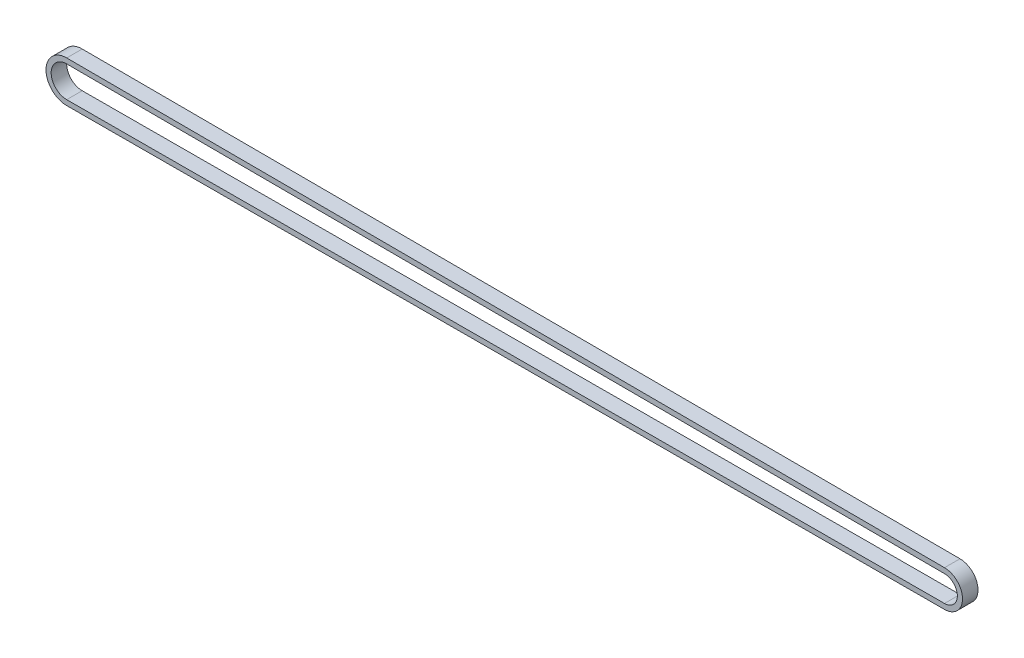
ISO-10303-21;
HEADER;
FILE_DESCRIPTION(('STEP AP214'),'2;1');
FILE_NAME('part.step','',(''),(''),'','','');
FILE_SCHEMA(('AUTOMOTIVE_DESIGN { 1 0 10303 214 1 1 1 1 }'));
ENDSEC;
DATA;
#1=APPLICATION_CONTEXT('core data for automotive mechanical design processes');
#2=APPLICATION_PROTOCOL_DEFINITION('international standard','automotive_design',2000,#1);
#3=PRODUCT_CONTEXT('',#1,'mechanical');
#4=PRODUCT('Part','Part','',(#3));
#5=PRODUCT_RELATED_PRODUCT_CATEGORY('part','',(#4));
#6=PRODUCT_DEFINITION_FORMATION('','',#4);
#7=PRODUCT_DEFINITION_CONTEXT('part definition',#1,'design');
#8=PRODUCT_DEFINITION('design','',#6,#7);
#9=PRODUCT_DEFINITION_SHAPE('','',#8);
#10=(LENGTH_UNIT() NAMED_UNIT(*) SI_UNIT(.MILLI.,.METRE.));
#11=(NAMED_UNIT(*) PLANE_ANGLE_UNIT() SI_UNIT($,.RADIAN.));
#12=(NAMED_UNIT(*) SI_UNIT($,.STERADIAN.) SOLID_ANGLE_UNIT());
#13=UNCERTAINTY_MEASURE_WITH_UNIT(LENGTH_MEASURE(1.E-05),#10,'distance_accuracy_value','');
#14=(GEOMETRIC_REPRESENTATION_CONTEXT(3) GLOBAL_UNCERTAINTY_ASSIGNED_CONTEXT((#13)) GLOBAL_UNIT_ASSIGNED_CONTEXT((#10,
#11,#12)) REPRESENTATION_CONTEXT('',''));
#15=CARTESIAN_POINT('',(0.,0.,0.));
#16=DIRECTION('',(0.,0.,1.));
#17=DIRECTION('',(1.,0.,0.));
#18=AXIS2_PLACEMENT_3D('',#15,#16,#17);
#19=CARTESIAN_POINT('',(-340.,0.,6.));
#20=DIRECTION('',(0.,0.,1.));
#21=DIRECTION('',(1.,0.,0.));
#22=AXIS2_PLACEMENT_3D('',#19,#20,#21);
#23=PLANE('',#22);
#24=CARTESIAN_POINT('',(-340.,0.,6.));
#25=DIRECTION('',(0.,0.,1.));
#26=DIRECTION('',(1.,0.,0.));
#27=AXIS2_PLACEMENT_3D('',#24,#25,#26);
#28=CIRCLE('',#27,8.);
#29=CARTESIAN_POINT('',(-339.976470588235,7.999965397849,6.));
#30=VERTEX_POINT('',#29);
#31=CARTESIAN_POINT('',(-339.976470588235,-7.99996539784908,6.));
#32=VERTEX_POINT('',#31);
#33=EDGE_CURVE('E134',#30,#32,#28,.T.);
#34=ORIENTED_EDGE('',*,*,#33,.T.);
#35=DIRECTION('',(0.99999567473113,0.00294117647058835,0.));
#36=VECTOR('',#35,1.);
#37=CARTESIAN_POINT('',(-339.976470588235,-7.99996539784908,6.));
#38=LINE('',#37,#36);
#39=CARTESIAN_POINT('',(0.0205882352941163,-6.99996972311791,6.));
#40=VERTEX_POINT('',#39);
#41=EDGE_CURVE('E137',#32,#40,#38,.T.);
#42=ORIENTED_EDGE('',*,*,#41,.T.);
#43=CARTESIAN_POINT('',(0.,0.,6.));
#44=DIRECTION('',(0.,0.,1.));
#45=DIRECTION('',(-1.,0.,0.));
#46=AXIS2_PLACEMENT_3D('',#43,#44,#45);
#47=CIRCLE('',#46,7.);
#48=CARTESIAN_POINT('',(0.0205882352940929,6.99996972311791,6.));
#49=VERTEX_POINT('',#48);
#50=EDGE_CURVE('E140',#40,#49,#47,.T.);
#51=ORIENTED_EDGE('',*,*,#50,.T.);
#52=DIRECTION('',(-0.99999567473113,0.00294117647058811,0.));
#53=VECTOR('',#52,1.);
#54=CARTESIAN_POINT('',(-339.976470588235,7.999965397849,6.));
#55=LINE('',#54,#53);
#56=EDGE_CURVE('E142',#49,#30,#55,.T.);
#57=ORIENTED_EDGE('',*,*,#56,.T.);
#58=EDGE_LOOP('',(#34,#42,#51,#57));
#59=FACE_BOUND('',#58,.T.);
#60=DIRECTION('',(0.99999567473113,0.00294117647058835,0.));
#61=VECTOR('',#60,1.);
#62=CARTESIAN_POINT('',(-339.982352941176,-5.99997404838682,6.));
#63=LINE('',#62,#61);
#64=CARTESIAN_POINT('',(-339.982352941176,-5.99997404838682,6.));
#65=VERTEX_POINT('',#64);
#66=CARTESIAN_POINT('',(0.0147058823529402,-4.99997837365565,6.));
#67=VERTEX_POINT('',#66);
#68=EDGE_CURVE('E106',#65,#67,#63,.T.);
#69=ORIENTED_EDGE('',*,*,#68,.F.);
#70=CARTESIAN_POINT('',(-340.,0.,6.));
#71=DIRECTION('',(0.,0.,1.));
#72=DIRECTION('',(1.,0.,0.));
#73=AXIS2_PLACEMENT_3D('',#70,#71,#72);
#74=CIRCLE('',#73,6.);
#75=CARTESIAN_POINT('',(-339.982352941176,5.99997404838674,6.));
#76=VERTEX_POINT('',#75);
#77=EDGE_CURVE('E98',#76,#65,#74,.T.);
#78=ORIENTED_EDGE('',*,*,#77,.F.);
#79=DIRECTION('',(-0.99999567473113,0.00294117647058811,0.));
#80=VECTOR('',#79,1.);
#81=CARTESIAN_POINT('',(-339.982352941176,5.99997404838674,6.));
#82=LINE('',#81,#80);
#83=CARTESIAN_POINT('',(0.0147058823529722,4.99997837365565,6.));
#84=VERTEX_POINT('',#83);
#85=EDGE_CURVE('E120',#84,#76,#82,.T.);
#86=ORIENTED_EDGE('',*,*,#85,.F.);
#87=CARTESIAN_POINT('',(0.,0.,6.));
#88=DIRECTION('',(0.,0.,1.));
#89=DIRECTION('',(-1.,0.,0.));
#90=AXIS2_PLACEMENT_3D('',#87,#88,#89);
#91=CIRCLE('',#90,5.);
#92=EDGE_CURVE('E118',#67,#84,#91,.T.);
#93=ORIENTED_EDGE('',*,*,#92,.F.);
#94=EDGE_LOOP('',(#69,#78,#86,#93));
#95=FACE_BOUND('',#94,.T.);
#96=ADVANCED_FACE('F33',(#59,#95),#23,.T.);
#97=CARTESIAN_POINT('',(-340.,0.,0.));
#98=DIRECTION('',(0.,0.,1.));
#99=DIRECTION('',(1.,0.,0.));
#100=AXIS2_PLACEMENT_3D('',#97,#98,#99);
#101=PLANE('',#100);
#102=CARTESIAN_POINT('',(-340.,0.,0.));
#103=DIRECTION('',(0.,0.,1.));
#104=DIRECTION('',(1.,0.,0.));
#105=AXIS2_PLACEMENT_3D('',#102,#103,#104);
#106=CIRCLE('',#105,8.);
#107=CARTESIAN_POINT('',(-339.976470588235,7.999965397849,0.));
#108=VERTEX_POINT('',#107);
#109=CARTESIAN_POINT('',(-339.976470588235,-7.99996539784908,0.));
#110=VERTEX_POINT('',#109);
#111=EDGE_CURVE('E114',#108,#110,#106,.T.);
#112=ORIENTED_EDGE('',*,*,#111,.F.);
#113=DIRECTION('',(-0.99999567473113,0.00294117647058811,0.));
#114=VECTOR('',#113,1.);
#115=CARTESIAN_POINT('',(-339.976470588235,7.999965397849,0.));
#116=LINE('',#115,#114);
#117=CARTESIAN_POINT('',(0.0205882352940929,6.99996972311791,0.));
#118=VERTEX_POINT('',#117);
#119=EDGE_CURVE('E138',#118,#108,#116,.T.);
#120=ORIENTED_EDGE('',*,*,#119,.F.);
#121=CARTESIAN_POINT('',(0.,0.,0.));
#122=DIRECTION('',(0.,0.,1.));
#123=DIRECTION('',(-1.,0.,0.));
#124=AXIS2_PLACEMENT_3D('',#121,#122,#123);
#125=CIRCLE('',#124,7.);
#126=CARTESIAN_POINT('',(0.0205882352941163,-6.99996972311791,0.));
#127=VERTEX_POINT('',#126);
#128=EDGE_CURVE('E149',#127,#118,#125,.T.);
#129=ORIENTED_EDGE('',*,*,#128,.F.);
#130=DIRECTION('',(0.99999567473113,0.00294117647058835,0.));
#131=VECTOR('',#130,1.);
#132=CARTESIAN_POINT('',(-339.976470588235,-7.99996539784908,0.));
#133=LINE('',#132,#131);
#134=EDGE_CURVE('E147',#110,#127,#133,.T.);
#135=ORIENTED_EDGE('',*,*,#134,.F.);
#136=EDGE_LOOP('',(#112,#120,#129,#135));
#137=FACE_BOUND('',#136,.T.);
#138=CARTESIAN_POINT('',(-340.,0.,0.));
#139=DIRECTION('',(0.,0.,1.));
#140=DIRECTION('',(1.,0.,0.));
#141=AXIS2_PLACEMENT_3D('',#138,#139,#140);
#142=CIRCLE('',#141,6.);
#143=CARTESIAN_POINT('',(-339.982352941176,5.99997404838674,0.));
#144=VERTEX_POINT('',#143);
#145=CARTESIAN_POINT('',(-339.982352941176,-5.99997404838682,0.));
#146=VERTEX_POINT('',#145);
#147=EDGE_CURVE('E56',#144,#146,#142,.T.);
#148=ORIENTED_EDGE('',*,*,#147,.T.);
#149=DIRECTION('',(0.99999567473113,0.00294117647058835,0.));
#150=VECTOR('',#149,1.);
#151=CARTESIAN_POINT('',(-339.982352941176,-5.99997404838682,0.));
#152=LINE('',#151,#150);
#153=CARTESIAN_POINT('',(0.0147058823529402,-4.99997837365565,0.));
#154=VERTEX_POINT('',#153);
#155=EDGE_CURVE('E113',#146,#154,#152,.T.);
#156=ORIENTED_EDGE('',*,*,#155,.T.);
#157=CARTESIAN_POINT('',(0.,0.,0.));
#158=DIRECTION('',(0.,0.,1.));
#159=DIRECTION('',(-1.,0.,0.));
#160=AXIS2_PLACEMENT_3D('',#157,#158,#159);
#161=CIRCLE('',#160,5.);
#162=CARTESIAN_POINT('',(0.0147058823529407,4.99997837365565,0.));
#163=VERTEX_POINT('',#162);
#164=EDGE_CURVE('E126',#154,#163,#161,.T.);
#165=ORIENTED_EDGE('',*,*,#164,.T.);
#166=DIRECTION('',(-0.99999567473113,0.00294117647058811,0.));
#167=VECTOR('',#166,1.);
#168=CARTESIAN_POINT('',(-339.982352941176,5.99997404838674,0.));
#169=LINE('',#168,#167);
#170=EDGE_CURVE('E107',#163,#144,#169,.T.);
#171=ORIENTED_EDGE('',*,*,#170,.T.);
#172=EDGE_LOOP('',(#148,#156,#165,#171));
#173=FACE_BOUND('',#172,.T.);
#174=ADVANCED_FACE('F167',(#137,#173),#101,.F.);
#175=CARTESIAN_POINT('',(-340.,0.,6.));
#176=DIRECTION('',(0.,0.,-1.));
#177=DIRECTION('',(-1.,0.,0.));
#178=AXIS2_PLACEMENT_3D('',#175,#176,#177);
#179=CYLINDRICAL_SURFACE('',#178,8.);
#180=ORIENTED_EDGE('',*,*,#111,.T.);
#181=DIRECTION('',(0.,0.,-1.));
#182=VECTOR('',#181,1.);
#183=CARTESIAN_POINT('',(-339.976470588235,-7.99996539784908,6.));
#184=LINE('',#183,#182);
#185=EDGE_CURVE('E11',#32,#110,#184,.T.);
#186=ORIENTED_EDGE('',*,*,#185,.F.);
#187=ORIENTED_EDGE('',*,*,#33,.F.);
#188=DIRECTION('',(0.,0.,-1.));
#189=VECTOR('',#188,1.);
#190=CARTESIAN_POINT('',(-339.976470588235,7.999965397849,6.));
#191=LINE('',#190,#189);
#192=EDGE_CURVE('E144',#30,#108,#191,.T.);
#193=ORIENTED_EDGE('',*,*,#192,.T.);
#194=EDGE_LOOP('',(#180,#186,#187,#193));
#195=FACE_BOUND('',#194,.T.);
#196=ADVANCED_FACE('F35',(#195),#179,.T.);
#197=CARTESIAN_POINT('',(-339.976470588235,-7.99996539784908,6.));
#198=DIRECTION('',(-0.00294117647058835,0.99999567473113,0.));
#199=DIRECTION('',(-0.999995674731131,-0.00294117647058836,0.));
#200=AXIS2_PLACEMENT_3D('',#197,#198,#199);
#201=PLANE('',#200);
#202=ORIENTED_EDGE('',*,*,#134,.T.);
#203=DIRECTION('',(0.,0.,-1.));
#204=VECTOR('',#203,1.);
#205=CARTESIAN_POINT('',(0.0205882352941163,-6.99996972311791,6.));
#206=LINE('',#205,#204);
#207=EDGE_CURVE('E41',#40,#127,#206,.T.);
#208=ORIENTED_EDGE('',*,*,#207,.F.);
#209=ORIENTED_EDGE('',*,*,#41,.F.);
#210=ORIENTED_EDGE('',*,*,#185,.T.);
#211=EDGE_LOOP('',(#202,#208,#209,#210));
#212=FACE_BOUND('',#211,.T.);
#213=ADVANCED_FACE('F177',(#212),#201,.F.);
#214=CARTESIAN_POINT('',(0.,0.,6.));
#215=DIRECTION('',(0.,0.,-1.));
#216=DIRECTION('',(-1.,0.,0.));
#217=AXIS2_PLACEMENT_3D('',#214,#215,#216);
#218=CYLINDRICAL_SURFACE('',#217,7.);
#219=ORIENTED_EDGE('',*,*,#128,.T.);
#220=DIRECTION('',(0.,0.,-1.));
#221=VECTOR('',#220,1.);
#222=CARTESIAN_POINT('',(0.0205882352940929,6.99996972311791,6.));
#223=LINE('',#222,#221);
#224=EDGE_CURVE('E154',#49,#118,#223,.T.);
#225=ORIENTED_EDGE('',*,*,#224,.F.);
#226=ORIENTED_EDGE('',*,*,#50,.F.);
#227=ORIENTED_EDGE('',*,*,#207,.T.);
#228=EDGE_LOOP('',(#219,#225,#226,#227));
#229=FACE_BOUND('',#228,.T.);
#230=ADVANCED_FACE('F161',(#229),#218,.T.);
#231=CARTESIAN_POINT('',(-339.976470588235,7.999965397849,6.));
#232=DIRECTION('',(-0.00294117647058811,-0.99999567473113,0.));
#233=DIRECTION('',(0.999995674731131,-0.00294117647058811,0.));
#234=AXIS2_PLACEMENT_3D('',#231,#232,#233);
#235=PLANE('',#234);
#236=ORIENTED_EDGE('',*,*,#119,.T.);
#237=ORIENTED_EDGE('',*,*,#192,.F.);
#238=ORIENTED_EDGE('',*,*,#56,.F.);
#239=ORIENTED_EDGE('',*,*,#224,.T.);
#240=EDGE_LOOP('',(#236,#237,#238,#239));
#241=FACE_BOUND('',#240,.T.);
#242=ADVANCED_FACE('F171',(#241),#235,.F.);
#243=CARTESIAN_POINT('',(-340.,0.,6.));
#244=DIRECTION('',(0.,0.,-1.));
#245=DIRECTION('',(-1.,0.,0.));
#246=AXIS2_PLACEMENT_3D('',#243,#244,#245);
#247=CYLINDRICAL_SURFACE('',#246,6.);
#248=ORIENTED_EDGE('',*,*,#147,.F.);
#249=DIRECTION('',(0.,0.,-1.));
#250=VECTOR('',#249,1.);
#251=CARTESIAN_POINT('',(-339.982352941176,5.99997404838674,6.));
#252=LINE('',#251,#250);
#253=EDGE_CURVE('E102',#76,#144,#252,.T.);
#254=ORIENTED_EDGE('',*,*,#253,.F.);
#255=ORIENTED_EDGE('',*,*,#77,.T.);
#256=DIRECTION('',(0.,0.,-1.));
#257=VECTOR('',#256,1.);
#258=CARTESIAN_POINT('',(-339.982352941176,-5.99997404838682,6.));
#259=LINE('',#258,#257);
#260=EDGE_CURVE('E101',#65,#146,#259,.T.);
#261=ORIENTED_EDGE('',*,*,#260,.T.);
#262=EDGE_LOOP('',(#248,#254,#255,#261));
#263=FACE_BOUND('',#262,.T.);
#264=ADVANCED_FACE('F100',(#263),#247,.F.);
#265=CARTESIAN_POINT('',(-339.982352941176,-5.99997404838682,6.));
#266=DIRECTION('',(-0.00294117647058835,0.99999567473113,0.));
#267=DIRECTION('',(-0.999995674731131,-0.00294117647058836,0.));
#268=AXIS2_PLACEMENT_3D('',#265,#266,#267);
#269=PLANE('',#268);
#270=ORIENTED_EDGE('',*,*,#155,.F.);
#271=ORIENTED_EDGE('',*,*,#260,.F.);
#272=ORIENTED_EDGE('',*,*,#68,.T.);
#273=DIRECTION('',(0.,0.,-1.));
#274=VECTOR('',#273,1.);
#275=CARTESIAN_POINT('',(0.0147058823529402,-4.99997837365565,6.));
#276=LINE('',#275,#274);
#277=EDGE_CURVE('E115',#67,#154,#276,.T.);
#278=ORIENTED_EDGE('',*,*,#277,.T.);
#279=EDGE_LOOP('',(#270,#271,#272,#278));
#280=FACE_BOUND('',#279,.T.);
#281=ADVANCED_FACE('F110',(#280),#269,.T.);
#282=CARTESIAN_POINT('',(0.,0.,6.));
#283=DIRECTION('',(0.,0.,-1.));
#284=DIRECTION('',(-1.,0.,0.));
#285=AXIS2_PLACEMENT_3D('',#282,#283,#284);
#286=CYLINDRICAL_SURFACE('',#285,5.);
#287=ORIENTED_EDGE('',*,*,#164,.F.);
#288=ORIENTED_EDGE('',*,*,#277,.F.);
#289=ORIENTED_EDGE('',*,*,#92,.T.);
#290=DIRECTION('',(0.,0.,-1.));
#291=VECTOR('',#290,1.);
#292=CARTESIAN_POINT('',(0.0147058823529407,4.99997837365565,6.));
#293=LINE('',#292,#291);
#294=EDGE_CURVE('E48',#84,#163,#293,.T.);
#295=ORIENTED_EDGE('',*,*,#294,.T.);
#296=EDGE_LOOP('',(#287,#288,#289,#295));
#297=FACE_BOUND('',#296,.T.);
#298=ADVANCED_FACE('F200',(#297),#286,.F.);
#299=CARTESIAN_POINT('',(-339.982352941176,5.99997404838674,6.));
#300=DIRECTION('',(-0.00294117647058811,-0.99999567473113,0.));
#301=DIRECTION('',(0.999995674731131,-0.00294117647058811,0.));
#302=AXIS2_PLACEMENT_3D('',#299,#300,#301);
#303=PLANE('',#302);
#304=ORIENTED_EDGE('',*,*,#170,.F.);
#305=ORIENTED_EDGE('',*,*,#294,.F.);
#306=ORIENTED_EDGE('',*,*,#85,.T.);
#307=ORIENTED_EDGE('',*,*,#253,.T.);
#308=EDGE_LOOP('',(#304,#305,#306,#307));
#309=FACE_BOUND('',#308,.T.);
#310=ADVANCED_FACE('F204',(#309),#303,.T.);
#311=CLOSED_SHELL('',(#96,#174,#196,#213,#230,#242,#264,#281,#298,#310));
#312=MANIFOLD_SOLID_BREP('B2',#311);
#313=ADVANCED_BREP_SHAPE_REPRESENTATION('',(#18,#312),#14);
#314=SHAPE_DEFINITION_REPRESENTATION(#9,#313);
ENDSEC;
END-ISO-10303-21;
